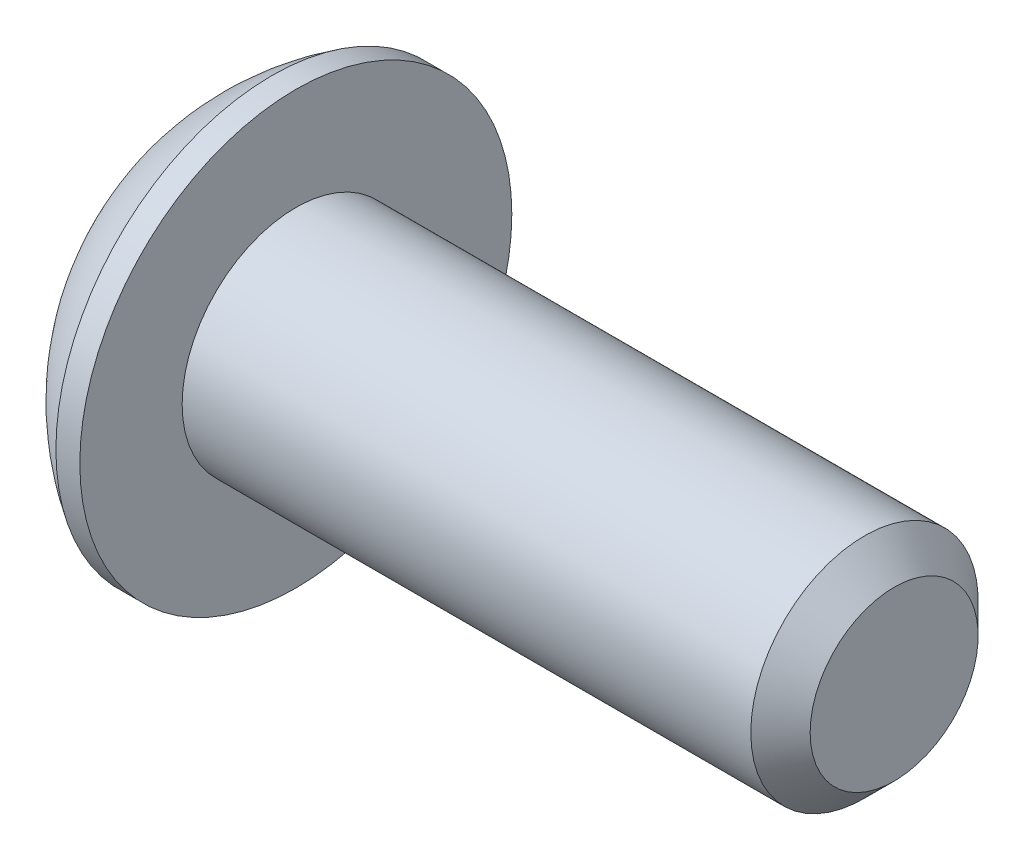
ISO-10303-21;
HEADER;
FILE_DESCRIPTION(('STEP AP214'),'2;1');
FILE_NAME('part.step','',(''),(''),'','','');
FILE_SCHEMA(('AUTOMOTIVE_DESIGN { 1 0 10303 214 1 1 1 1 }'));
ENDSEC;
DATA;
#1=APPLICATION_CONTEXT('core data for automotive mechanical design processes');
#2=APPLICATION_PROTOCOL_DEFINITION('international standard','automotive_design',2000,#1);
#3=PRODUCT_CONTEXT('',#1,'mechanical');
#4=PRODUCT('Part','Part','',(#3));
#5=PRODUCT_RELATED_PRODUCT_CATEGORY('part','',(#4));
#6=PRODUCT_DEFINITION_FORMATION('','',#4);
#7=PRODUCT_DEFINITION_CONTEXT('part definition',#1,'design');
#8=PRODUCT_DEFINITION('design','',#6,#7);
#9=PRODUCT_DEFINITION_SHAPE('','',#8);
#10=(LENGTH_UNIT() NAMED_UNIT(*) SI_UNIT(.MILLI.,.METRE.));
#11=(NAMED_UNIT(*) PLANE_ANGLE_UNIT() SI_UNIT($,.RADIAN.));
#12=(NAMED_UNIT(*) SI_UNIT($,.STERADIAN.) SOLID_ANGLE_UNIT());
#13=UNCERTAINTY_MEASURE_WITH_UNIT(LENGTH_MEASURE(1.E-05),#10,'distance_accuracy_value','');
#14=(GEOMETRIC_REPRESENTATION_CONTEXT(3) GLOBAL_UNCERTAINTY_ASSIGNED_CONTEXT((#13)) GLOBAL_UNIT_ASSIGNED_CONTEXT((#10,
#11,#12)) REPRESENTATION_CONTEXT('',''));
#15=CARTESIAN_POINT('',(0.,0.,0.));
#16=DIRECTION('',(0.,0.,1.));
#17=DIRECTION('',(1.,0.,0.));
#18=AXIS2_PLACEMENT_3D('',#15,#16,#17);
#19=CARTESIAN_POINT('',(0.,0.,0.));
#20=DIRECTION('',(-1.,0.,0.));
#21=DIRECTION('',(0.,0.,1.));
#22=AXIS2_PLACEMENT_3D('',#19,#20,#21);
#23=PLANE('',#22);
#24=CARTESIAN_POINT('',(0.,0.,0.));
#25=DIRECTION('',(-1.,0.,0.));
#26=DIRECTION('',(0.,0.,1.));
#27=AXIS2_PLACEMENT_3D('',#24,#25,#26);
#28=CIRCLE('',#27,2.29235);
#29=CARTESIAN_POINT('',(0.,2.29235,0.));
#30=VERTEX_POINT('',#29);
#31=EDGE_CURVE('E11',#30,#30,#28,.T.);
#32=ORIENTED_EDGE('',*,*,#31,.T.);
#33=EDGE_LOOP('',(#32));
#34=FACE_BOUND('',#33,.T.);
#35=DIRECTION('',(0.,-1.,0.));
#36=VECTOR('',#35,1.);
#37=CARTESIAN_POINT('',(0.,-0.91654355233853,1.5875));
#38=LINE('',#37,#36);
#39=CARTESIAN_POINT('',(0.,0.916543552338533,1.5875));
#40=VERTEX_POINT('',#39);
#41=CARTESIAN_POINT('',(0.,-0.91654355233853,1.5875));
#42=VERTEX_POINT('',#41);
#43=EDGE_CURVE('E47',#40,#42,#38,.T.);
#44=ORIENTED_EDGE('',*,*,#43,.T.);
#45=DIRECTION('',(0.,-0.5,-0.866025403784439));
#46=VECTOR('',#45,1.);
#47=CARTESIAN_POINT('',(0.,-1.83308710467706,0.));
#48=LINE('',#47,#46);
#49=CARTESIAN_POINT('',(0.,-1.83308710467706,0.));
#50=VERTEX_POINT('',#49);
#51=EDGE_CURVE('E363',#42,#50,#48,.T.);
#52=ORIENTED_EDGE('',*,*,#51,.T.);
#53=DIRECTION('',(0.,0.499999999999999,-0.866025403784439));
#54=VECTOR('',#53,1.);
#55=CARTESIAN_POINT('',(0.,-0.91654355233853,-1.5875));
#56=LINE('',#55,#54);
#57=CARTESIAN_POINT('',(0.,-0.91654355233853,-1.5875));
#58=VERTEX_POINT('',#57);
#59=EDGE_CURVE('E127',#50,#58,#56,.T.);
#60=ORIENTED_EDGE('',*,*,#59,.T.);
#61=DIRECTION('',(0.,1.,0.));
#62=VECTOR('',#61,1.);
#63=CARTESIAN_POINT('',(0.,0.916543552338532,-1.5875));
#64=LINE('',#63,#62);
#65=CARTESIAN_POINT('',(0.,0.916543552338532,-1.5875));
#66=VERTEX_POINT('',#65);
#67=EDGE_CURVE('E366',#58,#66,#64,.T.);
#68=ORIENTED_EDGE('',*,*,#67,.T.);
#69=DIRECTION('',(0.,0.5,0.866025403784438));
#70=VECTOR('',#69,1.);
#71=CARTESIAN_POINT('',(0.,1.83308710467706,0.));
#72=LINE('',#71,#70);
#73=CARTESIAN_POINT('',(0.,1.83308710467706,0.));
#74=VERTEX_POINT('',#73);
#75=EDGE_CURVE('E368',#66,#74,#72,.T.);
#76=ORIENTED_EDGE('',*,*,#75,.T.);
#77=DIRECTION('',(0.,-0.5,0.866025403784439));
#78=VECTOR('',#77,1.);
#79=CARTESIAN_POINT('',(0.,0.916543552338533,1.5875));
#80=LINE('',#79,#78);
#81=EDGE_CURVE('E370',#74,#40,#80,.T.);
#82=ORIENTED_EDGE('',*,*,#81,.T.);
#83=EDGE_LOOP('',(#44,#52,#60,#68,#76,#82));
#84=FACE_BOUND('',#83,.T.);
#85=ADVANCED_FACE('F33',(#34,#84),#23,.T.);
#86=CARTESIAN_POINT('',(4.85989606481482,0.,0.));
#87=DIRECTION('',(-1.,0.,0.));
#88=DIRECTION('',(0.,1.,0.));
#89=AXIS2_PLACEMENT_3D('',#86,#87,#88);
#90=SPHERICAL_SURFACE('',#89,5.37340285883187);
#91=CARTESIAN_POINT('',(2.0574,0.,0.));
#92=DIRECTION('',(-1.,0.,0.));
#93=DIRECTION('',(0.,0.,1.));
#94=AXIS2_PLACEMENT_3D('',#91,#92,#93);
#95=CIRCLE('',#94,4.5847);
#96=CARTESIAN_POINT('',(2.0574,4.5847,0.));
#97=VERTEX_POINT('',#96);
#98=EDGE_CURVE('E40',#97,#97,#95,.T.);
#99=CARTESIAN_POINT('',(2.0574,4.5847,0.));
#100=CARTESIAN_POINT('',(2.02963444466226,4.56772775071364,0.));
#101=CARTESIAN_POINT('',(2.00202310563314,4.55050321576171,0.));
#102=CARTESIAN_POINT('',(1.94711789153313,4.51555538986232,0.));
#103=CARTESIAN_POINT('',(1.91982401646224,4.49783209891487,0.));
#104=CARTESIAN_POINT('',(1.8655627616196,4.46189257636009,0.));
#105=CARTESIAN_POINT('',(1.83859538184787,4.44367634475277,0.));
#106=CARTESIAN_POINT('',(1.78499601309644,4.40675696303686,0.));
#107=CARTESIAN_POINT('',(1.75836402411674,4.38805381292827,0.));
#108=CARTESIAN_POINT('',(1.70544422925954,4.35016676527117,0.));
#109=CARTESIAN_POINT('',(1.67915642338203,4.33098286772266,0.));
#110=CARTESIAN_POINT('',(1.62693367141508,4.29214065809995,0.));
#111=CARTESIAN_POINT('',(1.60099872532564,4.27248234602574,0.));
#112=CARTESIAN_POINT('',(1.54949025368841,4.23269779601254,0.));
#113=CARTESIAN_POINT('',(1.52391672814064,4.21257155807355,0.));
#114=CARTESIAN_POINT('',(1.4731395388975,4.17185779967265,0.));
#115=CARTESIAN_POINT('',(1.44793587520214,4.15127027921074,0.));
#116=CARTESIAN_POINT('',(1.39790672892889,4.10964075130566,0.));
#117=CARTESIAN_POINT('',(1.37308124635099,4.08859874386249,0.));
#118=CARTESIAN_POINT('',(1.32381665673685,4.04606718757047,0.));
#119=CARTESIAN_POINT('',(1.29937754970059,4.02457763872164,0.));
#120=CARTESIAN_POINT('',(1.25089377806135,3.98115809291456,0.));
#121=CARTESIAN_POINT('',(1.22684911345837,3.95922809595632,0.));
#122=CARTESIAN_POINT('',(1.1791621633785,3.91493489261154,0.));
#123=CARTESIAN_POINT('',(1.15551987790161,3.89257168622499,0.));
#124=CARTESIAN_POINT('',(1.10864548994917,3.84741944569868,0.));
#125=CARTESIAN_POINT('',(1.08541338747362,3.82463041155892,0.));
#126=CARTESIAN_POINT('',(1.03936703400529,3.77863403775912,0.));
#127=CARTESIAN_POINT('',(1.01655278301252,3.75542669809907,0.));
#128=CARTESIAN_POINT('',(0.97134966306629,3.70860137356642,0.));
#129=CARTESIAN_POINT('',(0.948960794112831,3.68498338869381,0.));
#130=CARTESIAN_POINT('',(0.904615828391114,3.63734456959005,0.));
#131=CARTESIAN_POINT('',(0.882659731622856,3.61332373535889,0.));
#132=CARTESIAN_POINT('',(0.839187557567447,3.56488714636505,0.));
#133=CARTESIAN_POINT('',(0.817671480280296,3.54047139160237,0.));
#134=CARTESIAN_POINT('',(0.775086447240823,3.4912530207284,0.));
#135=CARTESIAN_POINT('',(0.754017491488502,3.46645040461709,0.));
#136=CARTESIAN_POINT('',(0.712333655985979,3.41646649792444,0.));
#137=CARTESIAN_POINT('',(0.691718776235777,3.39128520734308,0.));
#138=CARTESIAN_POINT('',(0.650949897322802,3.34055226358224,0.));
#139=CARTESIAN_POINT('',(0.630795898160028,3.31500061040275,0.));
#140=CARTESIAN_POINT('',(0.590955432879198,3.2635353755673,0.));
#141=CARTESIAN_POINT('',(0.571268966761141,3.23762179391134,0.));
#142=CARTESIAN_POINT('',(0.532370065703055,3.18544125571044,0.));
#143=CARTESIAN_POINT('',(0.513157630763025,3.1591742991655,0.));
#144=CARTESIAN_POINT('',(0.47521313372583,3.10629568141642,0.));
#145=CARTESIAN_POINT('',(0.456481071628664,3.07968402021228,0.));
#146=CARTESIAN_POINT('',(0.41950350337872,3.02612477715572,0.));
#147=CARTESIAN_POINT('',(0.401257997225941,2.9991771953033,0.));
#148=CARTESIAN_POINT('',(0.365259563367946,2.94495500583993,0.));
#149=CARTESIAN_POINT('',(0.34750663566273,2.91768039822897,0.));
#150=CARTESIAN_POINT('',(0.312499218594778,2.86281316009189,0.));
#151=CARTESIAN_POINT('',(0.295244729232042,2.83522052956578,0.));
#152=CARTESIAN_POINT('',(0.261239884283562,2.77972635338318,0.));
#153=CARTESIAN_POINT('',(0.24448952869782,2.7518248077267,0.));
#154=CARTESIAN_POINT('',(0.21149848009108,2.69572201115466,0.));
#155=CARTESIAN_POINT('',(0.195257787070082,2.66752076023909,0.));
#156=CARTESIAN_POINT('',(0.163291425052402,2.61082786150165,0.));
#157=CARTESIAN_POINT('',(0.147565756055719,2.58233621367977,0.));
#158=CARTESIAN_POINT('',(0.116634630180611,2.52507192700006,0.));
#159=CARTESIAN_POINT('',(0.101429173302187,2.49629928814223,0.));
#160=CARTESIAN_POINT('',(0.071543500606801,2.43848251180434,0.));
#161=CARTESIAN_POINT('',(0.0568632847898391,2.40943837432427,0.));
#162=CARTESIAN_POINT('',(0.0280329029081006,2.35108820593535,0.));
#163=CARTESIAN_POINT('',(0.013882736843324,2.3217821750265,0.));
#164=CARTESIAN_POINT('',(0.,2.29235,0.));
#165=B_SPLINE_CURVE_WITH_KNOTS('',3,(#99,#100,#101,#102,#103,#104,#105,#106,#107,#108,#109,#110,
#111,#112,#113,#114,#115,#116,#117,#118,#119,#120,#121,#122,#123,#124,#125,#126,#127,#128,#129,
#130,#131,#132,#133,#134,#135,#136,#137,#138,#139,#140,#141,#142,#143,#144,#145,#146,#147,#148,
#149,#150,#151,#152,#153,#154,#155,#156,#157,#158,#159,#160,#161,#162,#163,#164),.UNSPECIFIED.,
.F.,.F.,(4,2,2,2,2,2,2,2,2,2,2,2,2,2,2,2,2,2,2,2,2,2,2,2,2,2,2,2,2,2,2,2,4),(0.,
0.0976247266467792,0.195249453293559,0.292874179940338,0.390498906587117,0.488123633233896,
0.585748359880676,0.683373086527455,0.780997813174234,0.878622539821013,0.976247266467793,
1.07387199311457,1.17149671976135,1.26912144640813,1.36674617305491,1.46437089970169,
1.56199562634847,1.65962035299525,1.75724507964203,1.85486980628881,1.95249453293559,
2.05011925958236,2.14774398622914,2.24536871287592,2.3429934395227,2.44061816616948,
2.53824289281626,2.63586761946304,2.73349234610982,2.8311170727566,2.92874179940338,
3.02636652605016,3.12399125269694),.UNSPECIFIED.);
#166=EDGE_CURVE('BSEAM154',#97,#30,#165,.T.);
#167=ORIENTED_EDGE('',*,*,#98,.T.);
#168=ORIENTED_EDGE('',*,*,#31,.F.);
#169=ORIENTED_EDGE('',*,*,#166,.T.);
#170=ORIENTED_EDGE('',*,*,#166,.F.);
#171=EDGE_LOOP('',(#167,#169,#168,#170));
#172=FACE_BOUND('',#171,.T.);
#173=ADVANCED_FACE('F154',(#172),#90,.T.);
#174=CARTESIAN_POINT('',(0.,0.,0.));
#175=DIRECTION('',(-1.,0.,0.));
#176=DIRECTION('',(0.,0.,1.));
#177=AXIS2_PLACEMENT_3D('',#174,#175,#176);
#178=CYLINDRICAL_SURFACE('',#177,4.5847);
#179=ORIENTED_EDGE('',*,*,#98,.F.);
#180=EDGE_LOOP('',(#179));
#181=FACE_BOUND('',#180,.T.);
#182=CARTESIAN_POINT('',(2.5654,0.,0.));
#183=DIRECTION('',(-1.,0.,0.));
#184=DIRECTION('',(0.,0.,1.));
#185=AXIS2_PLACEMENT_3D('',#182,#183,#184);
#186=CIRCLE('',#185,4.5847);
#187=CARTESIAN_POINT('',(2.5654,0.,4.5847));
#188=VERTEX_POINT('',#187);
#189=EDGE_CURVE('E149',#188,#188,#186,.T.);
#190=ORIENTED_EDGE('',*,*,#189,.T.);
#191=EDGE_LOOP('',(#190));
#192=FACE_BOUND('',#191,.T.);
#193=ADVANCED_FACE('F157',(#181,#192),#178,.T.);
#194=CARTESIAN_POINT('',(2.5654,2.41299999999999,0.));
#195=DIRECTION('',(-1.,0.,0.));
#196=DIRECTION('',(0.,0.,1.));
#197=AXIS2_PLACEMENT_3D('',#194,#195,#196);
#198=PLANE('',#197);
#199=ORIENTED_EDGE('',*,*,#189,.F.);
#200=EDGE_LOOP('',(#199));
#201=FACE_BOUND('',#200,.T.);
#202=CARTESIAN_POINT('',(2.5654,0.,0.));
#203=DIRECTION('',(-1.,0.,0.));
#204=DIRECTION('',(0.,0.,1.));
#205=AXIS2_PLACEMENT_3D('',#202,#203,#204);
#206=CIRCLE('',#205,2.41299999999999);
#207=CARTESIAN_POINT('',(2.5654,0.,2.41299999999999));
#208=VERTEX_POINT('',#207);
#209=EDGE_CURVE('E146',#208,#208,#206,.T.);
#210=ORIENTED_EDGE('',*,*,#209,.T.);
#211=EDGE_LOOP('',(#210));
#212=FACE_BOUND('',#211,.T.);
#213=ADVANCED_FACE('F160',(#201,#212),#198,.F.);
#214=CARTESIAN_POINT('',(0.,0.,0.));
#215=DIRECTION('',(-1.,0.,0.));
#216=DIRECTION('',(0.,0.,1.));
#217=AXIS2_PLACEMENT_3D('',#214,#215,#216);
#218=CYLINDRICAL_SURFACE('',#217,2.41299999999999);
#219=ORIENTED_EDGE('',*,*,#209,.F.);
#220=EDGE_LOOP('',(#219));
#221=FACE_BOUND('',#220,.T.);
#222=CARTESIAN_POINT('',(14.63548,0.,0.));
#223=DIRECTION('',(-1.,0.,0.));
#224=DIRECTION('',(0.,0.,1.));
#225=AXIS2_PLACEMENT_3D('',#222,#223,#224);
#226=CIRCLE('',#225,2.41299999999999);
#227=CARTESIAN_POINT('',(14.63548,0.,2.41299999999999));
#228=VERTEX_POINT('',#227);
#229=EDGE_CURVE('E143',#228,#228,#226,.T.);
#230=ORIENTED_EDGE('',*,*,#229,.T.);
#231=EDGE_LOOP('',(#230));
#232=FACE_BOUND('',#231,.T.);
#233=ADVANCED_FACE('F166',(#221,#232),#218,.T.);
#234=CARTESIAN_POINT('',(15.2654,0.,0.));
#235=DIRECTION('',(-1.,0.,0.));
#236=DIRECTION('',(0.,0.,1.));
#237=AXIS2_PLACEMENT_3D('',#234,#235,#236);
#238=CONICAL_SURFACE('',#237,1.78308,0.785398163397464);
#239=ORIENTED_EDGE('',*,*,#229,.F.);
#240=EDGE_LOOP('',(#239));
#241=FACE_BOUND('',#240,.T.);
#242=CARTESIAN_POINT('',(15.2654,0.,0.));
#243=DIRECTION('',(-1.,0.,0.));
#244=DIRECTION('',(0.,0.,1.));
#245=AXIS2_PLACEMENT_3D('',#242,#243,#244);
#246=CIRCLE('',#245,1.78308);
#247=CARTESIAN_POINT('',(15.2654,0.,1.78308));
#248=VERTEX_POINT('',#247);
#249=EDGE_CURVE('E139',#248,#248,#246,.T.);
#250=ORIENTED_EDGE('',*,*,#249,.T.);
#251=EDGE_LOOP('',(#250));
#252=FACE_BOUND('',#251,.T.);
#253=ADVANCED_FACE('F172',(#241,#252),#238,.T.);
#254=CARTESIAN_POINT('',(15.2654,0.,0.));
#255=DIRECTION('',(-1.,0.,0.));
#256=DIRECTION('',(0.,0.,1.));
#257=AXIS2_PLACEMENT_3D('',#254,#255,#256);
#258=PLANE('',#257);
#259=ORIENTED_EDGE('',*,*,#249,.F.);
#260=EDGE_LOOP('',(#259));
#261=FACE_BOUND('',#260,.T.);
#262=ADVANCED_FACE('F178',(#261),#258,.F.);
#263=CARTESIAN_POINT('',(1.778,-1.83308710467706,0.));
#264=DIRECTION('',(0.,0.866025403784439,-0.5));
#265=DIRECTION('',(0.,0.5,0.866025403784439));
#266=AXIS2_PLACEMENT_3D('',#263,#264,#265);
#267=PLANE('',#266);
#268=DIRECTION('',(0.,-0.5,-0.866025403784439));
#269=VECTOR('',#268,1.);
#270=CARTESIAN_POINT('',(1.778,-1.83308710467706,0.));
#271=LINE('',#270,#269);
#272=CARTESIAN_POINT('',(1.778,-0.91654355233853,1.5875));
#273=VERTEX_POINT('',#272);
#274=CARTESIAN_POINT('',(1.778,-1.3748153285078,0.793749999999999));
#275=VERTEX_POINT('',#274);
#276=EDGE_CURVE('E113',#273,#275,#271,.T.);
#277=ORIENTED_EDGE('',*,*,#276,.T.);
#278=CARTESIAN_POINT('',(1.778,-1.83308710467706,0.));
#279=VERTEX_POINT('',#278);
#280=EDGE_CURVE('E108',#275,#279,#271,.T.);
#281=ORIENTED_EDGE('',*,*,#280,.T.);
#282=DIRECTION('',(-1.,0.,0.));
#283=VECTOR('',#282,1.);
#284=CARTESIAN_POINT('',(1.778,-1.83308710467706,0.));
#285=LINE('',#284,#283);
#286=EDGE_CURVE('E110',#279,#50,#285,.T.);
#287=ORIENTED_EDGE('',*,*,#286,.T.);
#288=ORIENTED_EDGE('',*,*,#51,.F.);
#289=DIRECTION('',(-1.,0.,0.));
#290=VECTOR('',#289,1.);
#291=CARTESIAN_POINT('',(1.778,-0.91654355233853,1.5875));
#292=LINE('',#291,#290);
#293=EDGE_CURVE('E358',#273,#42,#292,.T.);
#294=ORIENTED_EDGE('',*,*,#293,.F.);
#295=EDGE_LOOP('',(#277,#281,#287,#288,#294));
#296=FACE_BOUND('',#295,.T.);
#297=ADVANCED_FACE('F109',(#296),#267,.T.);
#298=CARTESIAN_POINT('',(1.778,-0.91654355233853,-1.5875));
#299=DIRECTION('',(0.,0.866025403784439,0.499999999999999));
#300=DIRECTION('',(0.,-0.499999999999999,0.866025403784439));
#301=AXIS2_PLACEMENT_3D('',#298,#299,#300);
#302=PLANE('',#301);
#303=DIRECTION('',(0.,0.499999999999999,-0.866025403784439));
#304=VECTOR('',#303,1.);
#305=CARTESIAN_POINT('',(1.778,-0.91654355233853,-1.5875));
#306=LINE('',#305,#304);
#307=CARTESIAN_POINT('',(1.778,-1.3748153285078,-0.793749999999999));
#308=VERTEX_POINT('',#307);
#309=EDGE_CURVE('E55',#279,#308,#306,.T.);
#310=ORIENTED_EDGE('',*,*,#309,.T.);
#311=CARTESIAN_POINT('',(1.778,-0.91654355233853,-1.5875));
#312=VERTEX_POINT('',#311);
#313=EDGE_CURVE('E122',#308,#312,#306,.T.);
#314=ORIENTED_EDGE('',*,*,#313,.T.);
#315=DIRECTION('',(-1.,0.,0.));
#316=VECTOR('',#315,1.);
#317=CARTESIAN_POINT('',(1.778,-0.91654355233853,-1.5875));
#318=LINE('',#317,#316);
#319=EDGE_CURVE('E129',#312,#58,#318,.T.);
#320=ORIENTED_EDGE('',*,*,#319,.T.);
#321=ORIENTED_EDGE('',*,*,#59,.F.);
#322=ORIENTED_EDGE('',*,*,#286,.F.);
#323=EDGE_LOOP('',(#310,#314,#320,#321,#322));
#324=FACE_BOUND('',#323,.T.);
#325=ADVANCED_FACE('F125',(#324),#302,.T.);
#326=CARTESIAN_POINT('',(1.778,0.916543552338532,-1.5875));
#327=DIRECTION('',(0.,0.,1.));
#328=DIRECTION('',(1.,0.,0.));
#329=AXIS2_PLACEMENT_3D('',#326,#327,#328);
#330=PLANE('',#329);
#331=DIRECTION('',(0.,1.,0.));
#332=VECTOR('',#331,1.);
#333=CARTESIAN_POINT('',(1.778,0.916543552338532,-1.5875));
#334=LINE('',#333,#332);
#335=CARTESIAN_POINT('',(1.778,0.,-1.5875));
#336=VERTEX_POINT('',#335);
#337=EDGE_CURVE('E388',#312,#336,#334,.T.);
#338=ORIENTED_EDGE('',*,*,#337,.T.);
#339=CARTESIAN_POINT('',(1.778,0.916543552338532,-1.5875));
#340=VERTEX_POINT('',#339);
#341=EDGE_CURVE('E121',#336,#340,#334,.T.);
#342=ORIENTED_EDGE('',*,*,#341,.T.);
#343=DIRECTION('',(-1.,0.,0.));
#344=VECTOR('',#343,1.);
#345=CARTESIAN_POINT('',(1.778,0.916543552338532,-1.5875));
#346=LINE('',#345,#344);
#347=EDGE_CURVE('E134',#340,#66,#346,.T.);
#348=ORIENTED_EDGE('',*,*,#347,.T.);
#349=ORIENTED_EDGE('',*,*,#67,.F.);
#350=ORIENTED_EDGE('',*,*,#319,.F.);
#351=EDGE_LOOP('',(#338,#342,#348,#349,#350));
#352=FACE_BOUND('',#351,.T.);
#353=ADVANCED_FACE('F237',(#352),#330,.T.);
#354=CARTESIAN_POINT('',(1.778,1.83308710467706,0.));
#355=DIRECTION('',(0.,-0.866025403784439,0.5));
#356=DIRECTION('',(0.,-0.5,-0.866025403784439));
#357=AXIS2_PLACEMENT_3D('',#354,#355,#356);
#358=PLANE('',#357);
#359=DIRECTION('',(0.,0.5,0.866025403784438));
#360=VECTOR('',#359,1.);
#361=CARTESIAN_POINT('',(1.778,1.83308710467706,0.));
#362=LINE('',#361,#360);
#363=CARTESIAN_POINT('',(1.778,1.3748153285078,-0.793750000000001));
#364=VERTEX_POINT('',#363);
#365=EDGE_CURVE('E392',#340,#364,#362,.T.);
#366=ORIENTED_EDGE('',*,*,#365,.T.);
#367=CARTESIAN_POINT('',(1.778,1.83308710467706,0.));
#368=VERTEX_POINT('',#367);
#369=EDGE_CURVE('E390',#364,#368,#362,.T.);
#370=ORIENTED_EDGE('',*,*,#369,.T.);
#371=DIRECTION('',(-1.,0.,0.));
#372=VECTOR('',#371,1.);
#373=CARTESIAN_POINT('',(1.778,1.83308710467706,0.));
#374=LINE('',#373,#372);
#375=EDGE_CURVE('E374',#368,#74,#374,.T.);
#376=ORIENTED_EDGE('',*,*,#375,.T.);
#377=ORIENTED_EDGE('',*,*,#75,.F.);
#378=ORIENTED_EDGE('',*,*,#347,.F.);
#379=EDGE_LOOP('',(#366,#370,#376,#377,#378));
#380=FACE_BOUND('',#379,.T.);
#381=ADVANCED_FACE('F246',(#380),#358,.T.);
#382=CARTESIAN_POINT('',(1.778,0.916543552338533,1.5875));
#383=DIRECTION('',(0.,-0.866025403784439,-0.5));
#384=DIRECTION('',(0.,0.5,-0.866025403784439));
#385=AXIS2_PLACEMENT_3D('',#382,#383,#384);
#386=PLANE('',#385);
#387=DIRECTION('',(0.,-0.5,0.866025403784439));
#388=VECTOR('',#387,1.);
#389=CARTESIAN_POINT('',(1.778,0.916543552338533,1.5875));
#390=LINE('',#389,#388);
#391=CARTESIAN_POINT('',(1.778,1.3748153285078,0.793750000000001));
#392=VERTEX_POINT('',#391);
#393=EDGE_CURVE('E353',#368,#392,#390,.T.);
#394=ORIENTED_EDGE('',*,*,#393,.T.);
#395=CARTESIAN_POINT('',(1.778,0.916543552338533,1.5875));
#396=VERTEX_POINT('',#395);
#397=EDGE_CURVE('E349',#392,#396,#390,.T.);
#398=ORIENTED_EDGE('',*,*,#397,.T.);
#399=DIRECTION('',(-1.,0.,0.));
#400=VECTOR('',#399,1.);
#401=CARTESIAN_POINT('',(1.778,0.916543552338533,1.5875));
#402=LINE('',#401,#400);
#403=EDGE_CURVE('E357',#396,#40,#402,.T.);
#404=ORIENTED_EDGE('',*,*,#403,.T.);
#405=ORIENTED_EDGE('',*,*,#81,.F.);
#406=ORIENTED_EDGE('',*,*,#375,.F.);
#407=EDGE_LOOP('',(#394,#398,#404,#405,#406));
#408=FACE_BOUND('',#407,.T.);
#409=ADVANCED_FACE('F256',(#408),#386,.T.);
#410=CARTESIAN_POINT('',(1.778,-0.91654355233853,1.5875));
#411=DIRECTION('',(0.,0.,-1.));
#412=DIRECTION('',(0.,1.,0.));
#413=AXIS2_PLACEMENT_3D('',#410,#411,#412);
#414=PLANE('',#413);
#415=DIRECTION('',(0.,-1.,0.));
#416=VECTOR('',#415,1.);
#417=CARTESIAN_POINT('',(1.778,-0.91654355233853,1.5875));
#418=LINE('',#417,#416);
#419=CARTESIAN_POINT('',(1.778,0.,1.5875));
#420=VERTEX_POINT('',#419);
#421=EDGE_CURVE('E348',#396,#420,#418,.T.);
#422=ORIENTED_EDGE('',*,*,#421,.T.);
#423=EDGE_CURVE('E351',#420,#273,#418,.T.);
#424=ORIENTED_EDGE('',*,*,#423,.T.);
#425=ORIENTED_EDGE('',*,*,#293,.T.);
#426=ORIENTED_EDGE('',*,*,#43,.F.);
#427=ORIENTED_EDGE('',*,*,#403,.F.);
#428=EDGE_LOOP('',(#422,#424,#425,#426,#427));
#429=FACE_BOUND('',#428,.T.);
#430=ADVANCED_FACE('F266',(#429),#414,.T.);
#431=CARTESIAN_POINT('',(1.778,-2.74963065701559,-1.5875));
#432=DIRECTION('',(1.,0.,0.));
#433=DIRECTION('',(0.,0.,-1.));
#434=AXIS2_PLACEMENT_3D('',#431,#432,#433);
#435=PLANE('',#434);
#436=CARTESIAN_POINT('',(1.778,0.,0.));
#437=DIRECTION('',(-1.,0.,0.));
#438=DIRECTION('',(0.,0.,1.));
#439=AXIS2_PLACEMENT_3D('',#436,#437,#438);
#440=CIRCLE('',#439,1.5875);
#441=EDGE_CURVE('E395',#364,#336,#440,.T.);
#442=ORIENTED_EDGE('',*,*,#441,.F.);
#443=ORIENTED_EDGE('',*,*,#365,.F.);
#444=ORIENTED_EDGE('',*,*,#341,.F.);
#445=EDGE_LOOP('',(#442,#443,#444));
#446=FACE_BOUND('',#445,.T.);
#447=ADVANCED_FACE('F276',(#446),#435,.F.);
#448=EDGE_CURVE('E140',#392,#364,#440,.T.);
#449=ORIENTED_EDGE('',*,*,#448,.F.);
#450=ORIENTED_EDGE('',*,*,#393,.F.);
#451=ORIENTED_EDGE('',*,*,#369,.F.);
#452=EDGE_LOOP('',(#449,#450,#451));
#453=FACE_BOUND('',#452,.T.);
#454=ADVANCED_FACE('F286',(#453),#435,.F.);
#455=EDGE_CURVE('E133',#420,#392,#440,.T.);
#456=ORIENTED_EDGE('',*,*,#455,.F.);
#457=ORIENTED_EDGE('',*,*,#421,.F.);
#458=ORIENTED_EDGE('',*,*,#397,.F.);
#459=EDGE_LOOP('',(#456,#457,#458));
#460=FACE_BOUND('',#459,.T.);
#461=ADVANCED_FACE('F297',(#460),#435,.F.);
#462=EDGE_CURVE('E128',#275,#420,#440,.T.);
#463=ORIENTED_EDGE('',*,*,#462,.F.);
#464=ORIENTED_EDGE('',*,*,#276,.F.);
#465=ORIENTED_EDGE('',*,*,#423,.F.);
#466=EDGE_LOOP('',(#463,#464,#465));
#467=FACE_BOUND('',#466,.T.);
#468=ADVANCED_FACE('F306',(#467),#435,.F.);
#469=EDGE_CURVE('E119',#308,#275,#440,.T.);
#470=ORIENTED_EDGE('',*,*,#469,.F.);
#471=ORIENTED_EDGE('',*,*,#309,.F.);
#472=ORIENTED_EDGE('',*,*,#280,.F.);
#473=EDGE_LOOP('',(#470,#471,#472));
#474=FACE_BOUND('',#473,.T.);
#475=ADVANCED_FACE('F118',(#474),#435,.F.);
#476=EDGE_CURVE('E389',#336,#308,#440,.T.);
#477=ORIENTED_EDGE('',*,*,#476,.F.);
#478=ORIENTED_EDGE('',*,*,#337,.F.);
#479=ORIENTED_EDGE('',*,*,#313,.F.);
#480=EDGE_LOOP('',(#477,#478,#479));
#481=FACE_BOUND('',#480,.T.);
#482=ADVANCED_FACE('F289',(#481),#435,.F.);
#483=CARTESIAN_POINT('',(2.69454355233854,0.,0.));
#484=DIRECTION('',(-1.,0.,0.));
#485=DIRECTION('',(0.,0.,1.));
#486=AXIS2_PLACEMENT_3D('',#483,#484,#485);
#487=CONICAL_SURFACE('',#486,0.,1.04719755119659);
#488=ORIENTED_EDGE('',*,*,#455,.T.);
#489=ORIENTED_EDGE('',*,*,#448,.T.);
#490=ORIENTED_EDGE('',*,*,#441,.T.);
#491=ORIENTED_EDGE('',*,*,#476,.T.);
#492=ORIENTED_EDGE('',*,*,#469,.T.);
#493=ORIENTED_EDGE('',*,*,#462,.T.);
#494=EDGE_LOOP('',(#488,#489,#490,#491,#492,#493));
#495=FACE_BOUND('',#494,.T.);
#496=CARTESIAN_POINT('',(2.69454355233854,0.,0.));
#497=VERTEX_POINT('',#496);
#498=VERTEX_LOOP('',#497);
#499=FACE_BOUND('',#498,.T.);
#500=ADVANCED_FACE('F330',(#495,#499),#487,.F.);
#501=CLOSED_SHELL('',(#85,#173,#193,#213,#233,#253,#262,#297,#325,#353,#381,#409,#430,#447,#454,
#461,#468,#475,#482,#500));
#502=MANIFOLD_SOLID_BREP('B2',#501);
#503=ADVANCED_BREP_SHAPE_REPRESENTATION('',(#18,#502),#14);
#504=SHAPE_DEFINITION_REPRESENTATION(#9,#503);
ENDSEC;
END-ISO-10303-21;
